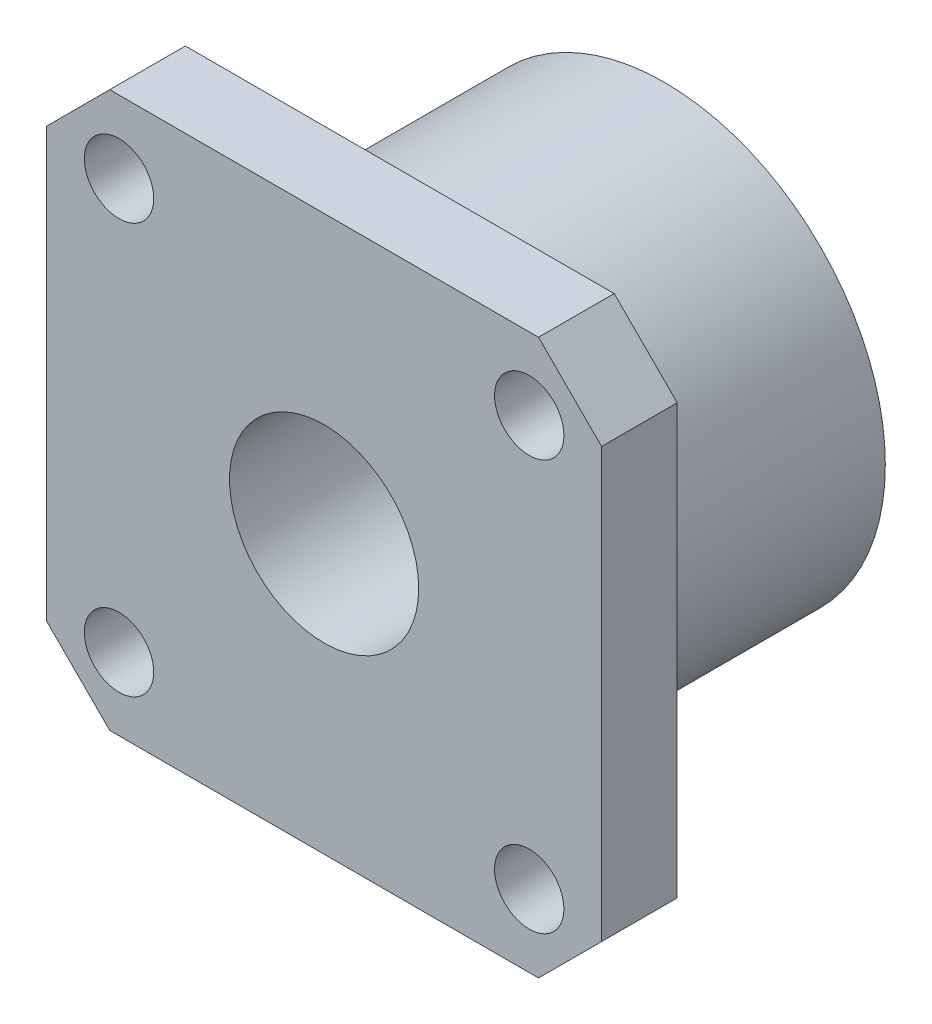
ISO-10303-21;
HEADER;
FILE_DESCRIPTION(('STEP AP214'),'2;1');
FILE_NAME('part.step','',(''),(''),'','','');
FILE_SCHEMA(('AUTOMOTIVE_DESIGN { 1 0 10303 214 1 1 1 1 }'));
ENDSEC;
DATA;
#1=APPLICATION_CONTEXT('core data for automotive mechanical design processes');
#2=APPLICATION_PROTOCOL_DEFINITION('international standard','automotive_design',2000,#1);
#3=PRODUCT_CONTEXT('',#1,'mechanical');
#4=PRODUCT('Part','Part','',(#3));
#5=PRODUCT_RELATED_PRODUCT_CATEGORY('part','',(#4));
#6=PRODUCT_DEFINITION_FORMATION('','',#4);
#7=PRODUCT_DEFINITION_CONTEXT('part definition',#1,'design');
#8=PRODUCT_DEFINITION('design','',#6,#7);
#9=PRODUCT_DEFINITION_SHAPE('','',#8);
#10=(LENGTH_UNIT() NAMED_UNIT(*) SI_UNIT(.MILLI.,.METRE.));
#11=(NAMED_UNIT(*) PLANE_ANGLE_UNIT() SI_UNIT($,.RADIAN.));
#12=(NAMED_UNIT(*) SI_UNIT($,.STERADIAN.) SOLID_ANGLE_UNIT());
#13=UNCERTAINTY_MEASURE_WITH_UNIT(LENGTH_MEASURE(1.E-05),#10,'distance_accuracy_value','');
#14=(GEOMETRIC_REPRESENTATION_CONTEXT(3) GLOBAL_UNCERTAINTY_ASSIGNED_CONTEXT((#13)) GLOBAL_UNIT_ASSIGNED_CONTEXT((#10,
#11,#12)) REPRESENTATION_CONTEXT('',''));
#15=CARTESIAN_POINT('',(0.,0.,0.));
#16=DIRECTION('',(0.,0.,1.));
#17=DIRECTION('',(1.,0.,0.));
#18=AXIS2_PLACEMENT_3D('',#15,#16,#17);
#19=CARTESIAN_POINT('',(0.,0.,6.));
#20=DIRECTION('',(0.,0.,1.));
#21=DIRECTION('',(1.,0.,0.));
#22=AXIS2_PLACEMENT_3D('',#19,#20,#21);
#23=PLANE('',#22);
#24=CARTESIAN_POINT('',(0.,0.,6.));
#25=DIRECTION('',(0.,0.,-1.));
#26=DIRECTION('',(-1.,0.,0.));
#27=AXIS2_PLACEMENT_3D('',#24,#25,#26);
#28=CIRCLE('',#27,7.5);
#29=CARTESIAN_POINT('',(7.5,0.,6.));
#30=VERTEX_POINT('',#29);
#31=EDGE_CURVE('E405',#30,#30,#28,.T.);
#32=ORIENTED_EDGE('',*,*,#31,.T.);
#33=EDGE_LOOP('',(#32));
#34=FACE_BOUND('',#33,.T.);
#35=CARTESIAN_POINT('',(16.2634559672916,-16.2634559672896,6.));
#36=DIRECTION('',(0.,0.,1.));
#37=DIRECTION('',(1.,0.,0.));
#38=AXIS2_PLACEMENT_3D('',#35,#36,#37);
#39=CIRCLE('',#38,2.75);
#40=CARTESIAN_POINT('',(19.0134559672916,-16.2634559672896,6.));
#41=VERTEX_POINT('',#40);
#42=EDGE_CURVE('E232',#41,#41,#39,.T.);
#43=ORIENTED_EDGE('',*,*,#42,.F.);
#44=EDGE_LOOP('',(#43));
#45=FACE_BOUND('',#44,.T.);
#46=CARTESIAN_POINT('',(-16.2634559672906,16.2634559672906,6.));
#47=DIRECTION('',(0.,0.,1.));
#48=DIRECTION('',(1.,0.,0.));
#49=AXIS2_PLACEMENT_3D('',#46,#47,#48);
#50=CIRCLE('',#49,2.75);
#51=CARTESIAN_POINT('',(-13.5134559672906,16.2634559672906,6.));
#52=VERTEX_POINT('',#51);
#53=EDGE_CURVE('E148',#52,#52,#50,.T.);
#54=ORIENTED_EDGE('',*,*,#53,.F.);
#55=EDGE_LOOP('',(#54));
#56=FACE_BOUND('',#55,.T.);
#57=DIRECTION('',(0.,-1.,0.));
#58=VECTOR('',#57,1.);
#59=CARTESIAN_POINT('',(-22.,-22.,6.));
#60=LINE('',#59,#58);
#61=CARTESIAN_POINT('',(-22.,17.,6.));
#62=VERTEX_POINT('',#61);
#63=CARTESIAN_POINT('',(-22.,-17.,6.));
#64=VERTEX_POINT('',#63);
#65=EDGE_CURVE('E154',#62,#64,#60,.T.);
#66=ORIENTED_EDGE('',*,*,#65,.T.);
#67=DIRECTION('',(-0.707106781186546,0.707106781186549,0.));
#68=VECTOR('',#67,1.);
#69=CARTESIAN_POINT('',(-19.5,-19.5,6.));
#70=LINE('',#69,#68);
#71=CARTESIAN_POINT('',(-17.,-22.,6.));
#72=VERTEX_POINT('',#71);
#73=EDGE_CURVE('E178',#64,#72,#70,.F.);
#74=ORIENTED_EDGE('',*,*,#73,.T.);
#75=DIRECTION('',(1.,0.,0.));
#76=VECTOR('',#75,1.);
#77=CARTESIAN_POINT('',(22.,-22.,6.));
#78=LINE('',#77,#76);
#79=CARTESIAN_POINT('',(17.,-22.,6.));
#80=VERTEX_POINT('',#79);
#81=EDGE_CURVE('E131',#72,#80,#78,.T.);
#82=ORIENTED_EDGE('',*,*,#81,.T.);
#83=DIRECTION('',(-0.707106781186549,-0.707106781186546,0.));
#84=VECTOR('',#83,1.);
#85=CARTESIAN_POINT('',(19.5,-19.5,6.));
#86=LINE('',#85,#84);
#87=CARTESIAN_POINT('',(22.,-17.,6.));
#88=VERTEX_POINT('',#87);
#89=EDGE_CURVE('E175',#80,#88,#86,.F.);
#90=ORIENTED_EDGE('',*,*,#89,.T.);
#91=DIRECTION('',(0.,1.,0.));
#92=VECTOR('',#91,1.);
#93=CARTESIAN_POINT('',(22.,-22.,6.));
#94=LINE('',#93,#92);
#95=CARTESIAN_POINT('',(22.,17.,6.));
#96=VERTEX_POINT('',#95);
#97=EDGE_CURVE('E205',#88,#96,#94,.T.);
#98=ORIENTED_EDGE('',*,*,#97,.T.);
#99=DIRECTION('',(0.707106781186547,-0.707106781186549,0.));
#100=VECTOR('',#99,1.);
#101=CARTESIAN_POINT('',(19.5,19.5,6.));
#102=LINE('',#101,#100);
#103=CARTESIAN_POINT('',(17.,22.,6.));
#104=VERTEX_POINT('',#103);
#105=EDGE_CURVE('E65',#96,#104,#102,.F.);
#106=ORIENTED_EDGE('',*,*,#105,.T.);
#107=DIRECTION('',(-1.,0.,0.));
#108=VECTOR('',#107,1.);
#109=CARTESIAN_POINT('',(22.,22.,6.));
#110=LINE('',#109,#108);
#111=CARTESIAN_POINT('',(-17.,22.,6.));
#112=VERTEX_POINT('',#111);
#113=EDGE_CURVE('E156',#104,#112,#110,.T.);
#114=ORIENTED_EDGE('',*,*,#113,.T.);
#115=DIRECTION('',(0.707106781186549,0.707106781186546,0.));
#116=VECTOR('',#115,1.);
#117=CARTESIAN_POINT('',(-19.5,19.5,6.));
#118=LINE('',#117,#116);
#119=EDGE_CURVE('E170',#112,#62,#118,.F.);
#120=ORIENTED_EDGE('',*,*,#119,.T.);
#121=EDGE_LOOP('',(#66,#74,#82,#90,#98,#106,#114,#120));
#122=FACE_BOUND('',#121,.T.);
#123=CARTESIAN_POINT('',(16.2634559672906,16.2634559672916,6.));
#124=DIRECTION('',(0.,0.,1.));
#125=DIRECTION('',(1.,0.,0.));
#126=AXIS2_PLACEMENT_3D('',#123,#124,#125);
#127=CIRCLE('',#126,2.75);
#128=CARTESIAN_POINT('',(19.0134559672906,16.2634559672916,6.));
#129=VERTEX_POINT('',#128);
#130=EDGE_CURVE('E220',#129,#129,#127,.T.);
#131=ORIENTED_EDGE('',*,*,#130,.F.);
#132=EDGE_LOOP('',(#131));
#133=FACE_BOUND('',#132,.T.);
#134=CARTESIAN_POINT('',(-16.2634559672896,-16.2634559672906,6.));
#135=DIRECTION('',(0.,0.,1.));
#136=DIRECTION('',(1.,0.,0.));
#137=AXIS2_PLACEMENT_3D('',#134,#135,#136);
#138=CIRCLE('',#137,2.75);
#139=CARTESIAN_POINT('',(-13.5134559672896,-16.2634559672906,6.));
#140=VERTEX_POINT('',#139);
#141=EDGE_CURVE('E223',#140,#140,#138,.T.);
#142=ORIENTED_EDGE('',*,*,#141,.F.);
#143=EDGE_LOOP('',(#142));
#144=FACE_BOUND('',#143,.T.);
#145=ADVANCED_FACE('F41',(#34,#45,#56,#122,#133,#144),#23,.T.);
#146=CARTESIAN_POINT('',(0.,0.,0.));
#147=DIRECTION('',(0.,0.,1.));
#148=DIRECTION('',(1.,0.,0.));
#149=AXIS2_PLACEMENT_3D('',#146,#147,#148);
#150=PLANE('',#149);
#151=CARTESIAN_POINT('',(0.,0.,0.));
#152=DIRECTION('',(0.,0.,1.));
#153=DIRECTION('',(1.,0.,0.));
#154=AXIS2_PLACEMENT_3D('',#151,#152,#153);
#155=CIRCLE('',#154,17.5);
#156=CARTESIAN_POINT('',(17.5,0.,0.));
#157=VERTEX_POINT('',#156);
#158=EDGE_CURVE('E11',#157,#157,#155,.F.);
#159=ORIENTED_EDGE('',*,*,#158,.F.);
#160=EDGE_LOOP('',(#159));
#161=FACE_BOUND('',#160,.T.);
#162=DIRECTION('',(1.,0.,0.));
#163=VECTOR('',#162,1.);
#164=CARTESIAN_POINT('',(22.,-22.,0.));
#165=LINE('',#164,#163);
#166=CARTESIAN_POINT('',(-17.,-22.,0.));
#167=VERTEX_POINT('',#166);
#168=CARTESIAN_POINT('',(17.,-22.,0.));
#169=VERTEX_POINT('',#168);
#170=EDGE_CURVE('E128',#167,#169,#165,.T.);
#171=ORIENTED_EDGE('',*,*,#170,.F.);
#172=DIRECTION('',(0.707106781186546,-0.707106781186549,0.));
#173=VECTOR('',#172,1.);
#174=CARTESIAN_POINT('',(-17.,-22.,0.));
#175=LINE('',#174,#173);
#176=CARTESIAN_POINT('',(-22.,-17.,0.));
#177=VERTEX_POINT('',#176);
#178=EDGE_CURVE('E110',#167,#177,#175,.F.);
#179=ORIENTED_EDGE('',*,*,#178,.T.);
#180=DIRECTION('',(0.,-1.,0.));
#181=VECTOR('',#180,1.);
#182=CARTESIAN_POINT('',(-22.,-22.,0.));
#183=LINE('',#182,#181);
#184=CARTESIAN_POINT('',(-22.,17.,0.));
#185=VERTEX_POINT('',#184);
#186=EDGE_CURVE('E141',#185,#177,#183,.T.);
#187=ORIENTED_EDGE('',*,*,#186,.F.);
#188=DIRECTION('',(-0.707106781186549,-0.707106781186546,0.));
#189=VECTOR('',#188,1.);
#190=CARTESIAN_POINT('',(-22.,17.,0.));
#191=LINE('',#190,#189);
#192=CARTESIAN_POINT('',(-17.,22.,0.));
#193=VERTEX_POINT('',#192);
#194=EDGE_CURVE('E133',#185,#193,#191,.F.);
#195=ORIENTED_EDGE('',*,*,#194,.T.);
#196=DIRECTION('',(-1.,0.,0.));
#197=VECTOR('',#196,1.);
#198=CARTESIAN_POINT('',(22.,22.,0.));
#199=LINE('',#198,#197);
#200=CARTESIAN_POINT('',(17.,22.,0.));
#201=VERTEX_POINT('',#200);
#202=EDGE_CURVE('E146',#201,#193,#199,.T.);
#203=ORIENTED_EDGE('',*,*,#202,.F.);
#204=DIRECTION('',(-0.707106781186547,0.707106781186549,0.));
#205=VECTOR('',#204,1.);
#206=CARTESIAN_POINT('',(17.,22.,0.));
#207=LINE('',#206,#205);
#208=CARTESIAN_POINT('',(22.,17.,0.));
#209=VERTEX_POINT('',#208);
#210=EDGE_CURVE('E160',#201,#209,#207,.F.);
#211=ORIENTED_EDGE('',*,*,#210,.T.);
#212=DIRECTION('',(0.,1.,0.));
#213=VECTOR('',#212,1.);
#214=CARTESIAN_POINT('',(22.,-22.,0.));
#215=LINE('',#214,#213);
#216=CARTESIAN_POINT('',(22.,-17.,0.));
#217=VERTEX_POINT('',#216);
#218=EDGE_CURVE('E140',#217,#209,#215,.T.);
#219=ORIENTED_EDGE('',*,*,#218,.F.);
#220=DIRECTION('',(0.707106781186549,0.707106781186546,0.));
#221=VECTOR('',#220,1.);
#222=CARTESIAN_POINT('',(22.,-17.,0.));
#223=LINE('',#222,#221);
#224=EDGE_CURVE('E122',#217,#169,#223,.F.);
#225=ORIENTED_EDGE('',*,*,#224,.T.);
#226=EDGE_LOOP('',(#171,#179,#187,#195,#203,#211,#219,#225));
#227=FACE_BOUND('',#226,.T.);
#228=CARTESIAN_POINT('',(-16.2634559672906,16.2634559672906,0.));
#229=DIRECTION('',(0.,0.,1.));
#230=DIRECTION('',(1.,0.,0.));
#231=AXIS2_PLACEMENT_3D('',#228,#229,#230);
#232=CIRCLE('',#231,2.75);
#233=CARTESIAN_POINT('',(-13.5134559672906,16.2634559672906,0.));
#234=VERTEX_POINT('',#233);
#235=EDGE_CURVE('E208',#234,#234,#232,.T.);
#236=ORIENTED_EDGE('',*,*,#235,.T.);
#237=EDGE_LOOP('',(#236));
#238=FACE_BOUND('',#237,.T.);
#239=CARTESIAN_POINT('',(16.2634559672906,16.2634559672916,0.));
#240=DIRECTION('',(0.,0.,1.));
#241=DIRECTION('',(1.,0.,0.));
#242=AXIS2_PLACEMENT_3D('',#239,#240,#241);
#243=CIRCLE('',#242,2.75);
#244=CARTESIAN_POINT('',(19.0134559672906,16.2634559672916,0.));
#245=VERTEX_POINT('',#244);
#246=EDGE_CURVE('E242',#245,#245,#243,.T.);
#247=ORIENTED_EDGE('',*,*,#246,.T.);
#248=EDGE_LOOP('',(#247));
#249=FACE_BOUND('',#248,.T.);
#250=CARTESIAN_POINT('',(16.2634559672916,-16.2634559672896,0.));
#251=DIRECTION('',(0.,0.,1.));
#252=DIRECTION('',(1.,0.,0.));
#253=AXIS2_PLACEMENT_3D('',#250,#251,#252);
#254=CIRCLE('',#253,2.75);
#255=CARTESIAN_POINT('',(19.0134559672916,-16.2634559672896,0.));
#256=VERTEX_POINT('',#255);
#257=EDGE_CURVE('E226',#256,#256,#254,.T.);
#258=ORIENTED_EDGE('',*,*,#257,.T.);
#259=EDGE_LOOP('',(#258));
#260=FACE_BOUND('',#259,.T.);
#261=CARTESIAN_POINT('',(-16.2634559672896,-16.2634559672906,0.));
#262=DIRECTION('',(0.,0.,1.));
#263=DIRECTION('',(1.,0.,0.));
#264=AXIS2_PLACEMENT_3D('',#261,#262,#263);
#265=CIRCLE('',#264,2.75);
#266=CARTESIAN_POINT('',(-13.5134559672896,-16.2634559672906,0.));
#267=VERTEX_POINT('',#266);
#268=EDGE_CURVE('E227',#267,#267,#265,.T.);
#269=ORIENTED_EDGE('',*,*,#268,.T.);
#270=EDGE_LOOP('',(#269));
#271=FACE_BOUND('',#270,.T.);
#272=ADVANCED_FACE('F136',(#161,#227,#238,#249,#260,#271),#150,.F.);
#273=CARTESIAN_POINT('',(-22.,-22.,6.));
#274=DIRECTION('',(1.,0.,0.));
#275=DIRECTION('',(0.,0.,-1.));
#276=AXIS2_PLACEMENT_3D('',#273,#274,#275);
#277=PLANE('',#276);
#278=ORIENTED_EDGE('',*,*,#186,.T.);
#279=DIRECTION('',(0.,0.,1.));
#280=VECTOR('',#279,1.);
#281=CARTESIAN_POINT('',(-22.,-17.,6.));
#282=LINE('',#281,#280);
#283=EDGE_CURVE('E115',#177,#64,#282,.T.);
#284=ORIENTED_EDGE('',*,*,#283,.T.);
#285=ORIENTED_EDGE('',*,*,#65,.F.);
#286=DIRECTION('',(0.,0.,-1.));
#287=VECTOR('',#286,1.);
#288=CARTESIAN_POINT('',(-22.,17.,6.));
#289=LINE('',#288,#287);
#290=EDGE_CURVE('E121',#62,#185,#289,.T.);
#291=ORIENTED_EDGE('',*,*,#290,.T.);
#292=EDGE_LOOP('',(#278,#284,#285,#291));
#293=FACE_BOUND('',#292,.T.);
#294=ADVANCED_FACE('F200',(#293),#277,.F.);
#295=CARTESIAN_POINT('',(22.,-22.,6.));
#296=DIRECTION('',(0.,1.,0.));
#297=DIRECTION('',(-1.,0.,0.));
#298=AXIS2_PLACEMENT_3D('',#295,#296,#297);
#299=PLANE('',#298);
#300=ORIENTED_EDGE('',*,*,#81,.F.);
#301=DIRECTION('',(0.,0.,-1.));
#302=VECTOR('',#301,1.);
#303=CARTESIAN_POINT('',(-17.,-22.,6.));
#304=LINE('',#303,#302);
#305=EDGE_CURVE('E114',#72,#167,#304,.T.);
#306=ORIENTED_EDGE('',*,*,#305,.T.);
#307=ORIENTED_EDGE('',*,*,#170,.T.);
#308=DIRECTION('',(0.,0.,1.));
#309=VECTOR('',#308,1.);
#310=CARTESIAN_POINT('',(17.,-22.,6.));
#311=LINE('',#310,#309);
#312=EDGE_CURVE('E134',#169,#80,#311,.T.);
#313=ORIENTED_EDGE('',*,*,#312,.T.);
#314=EDGE_LOOP('',(#300,#306,#307,#313));
#315=FACE_BOUND('',#314,.T.);
#316=ADVANCED_FACE('F127',(#315),#299,.F.);
#317=CARTESIAN_POINT('',(22.,-22.,6.));
#318=DIRECTION('',(-1.,0.,0.));
#319=DIRECTION('',(0.,0.,1.));
#320=AXIS2_PLACEMENT_3D('',#317,#318,#319);
#321=PLANE('',#320);
#322=ORIENTED_EDGE('',*,*,#97,.F.);
#323=DIRECTION('',(0.,0.,-1.));
#324=VECTOR('',#323,1.);
#325=CARTESIAN_POINT('',(22.,-17.,6.));
#326=LINE('',#325,#324);
#327=EDGE_CURVE('E184',#88,#217,#326,.T.);
#328=ORIENTED_EDGE('',*,*,#327,.T.);
#329=ORIENTED_EDGE('',*,*,#218,.T.);
#330=DIRECTION('',(0.,0.,1.));
#331=VECTOR('',#330,1.);
#332=CARTESIAN_POINT('',(22.,17.,6.));
#333=LINE('',#332,#331);
#334=EDGE_CURVE('E181',#209,#96,#333,.T.);
#335=ORIENTED_EDGE('',*,*,#334,.T.);
#336=EDGE_LOOP('',(#322,#328,#329,#335));
#337=FACE_BOUND('',#336,.T.);
#338=ADVANCED_FACE('F268',(#337),#321,.F.);
#339=CARTESIAN_POINT('',(22.,22.,6.));
#340=DIRECTION('',(0.,-1.,0.));
#341=DIRECTION('',(1.,0.,0.));
#342=AXIS2_PLACEMENT_3D('',#339,#340,#341);
#343=PLANE('',#342);
#344=ORIENTED_EDGE('',*,*,#113,.F.);
#345=DIRECTION('',(0.,0.,-1.));
#346=VECTOR('',#345,1.);
#347=CARTESIAN_POINT('',(17.,22.,6.));
#348=LINE('',#347,#346);
#349=EDGE_CURVE('E51',#104,#201,#348,.T.);
#350=ORIENTED_EDGE('',*,*,#349,.T.);
#351=ORIENTED_EDGE('',*,*,#202,.T.);
#352=DIRECTION('',(0.,0.,1.));
#353=VECTOR('',#352,1.);
#354=CARTESIAN_POINT('',(-17.,22.,6.));
#355=LINE('',#354,#353);
#356=EDGE_CURVE('E58',#193,#112,#355,.T.);
#357=ORIENTED_EDGE('',*,*,#356,.T.);
#358=EDGE_LOOP('',(#344,#350,#351,#357));
#359=FACE_BOUND('',#358,.T.);
#360=ADVANCED_FACE('F193',(#359),#343,.F.);
#361=CARTESIAN_POINT('',(-16.2634559672906,16.2634559672906,6.));
#362=DIRECTION('',(0.,0.,-1.));
#363=DIRECTION('',(-1.,0.,0.));
#364=AXIS2_PLACEMENT_3D('',#361,#362,#363);
#365=CYLINDRICAL_SURFACE('',#364,2.75);
#366=ORIENTED_EDGE('',*,*,#53,.T.);
#367=EDGE_LOOP('',(#366));
#368=FACE_BOUND('',#367,.T.);
#369=ORIENTED_EDGE('',*,*,#235,.F.);
#370=EDGE_LOOP('',(#369));
#371=FACE_BOUND('',#370,.T.);
#372=ADVANCED_FACE('F257',(#368,#371),#365,.F.);
#373=CARTESIAN_POINT('',(16.2634559672906,16.2634559672916,6.));
#374=DIRECTION('',(0.,0.,-1.));
#375=DIRECTION('',(-1.,0.,0.));
#376=AXIS2_PLACEMENT_3D('',#373,#374,#375);
#377=CYLINDRICAL_SURFACE('',#376,2.75);
#378=ORIENTED_EDGE('',*,*,#130,.T.);
#379=EDGE_LOOP('',(#378));
#380=FACE_BOUND('',#379,.T.);
#381=ORIENTED_EDGE('',*,*,#246,.F.);
#382=EDGE_LOOP('',(#381));
#383=FACE_BOUND('',#382,.T.);
#384=ADVANCED_FACE('F259',(#380,#383),#377,.F.);
#385=CARTESIAN_POINT('',(16.2634559672916,-16.2634559672896,6.));
#386=DIRECTION('',(0.,0.,-1.));
#387=DIRECTION('',(-1.,0.,0.));
#388=AXIS2_PLACEMENT_3D('',#385,#386,#387);
#389=CYLINDRICAL_SURFACE('',#388,2.75);
#390=ORIENTED_EDGE('',*,*,#42,.T.);
#391=EDGE_LOOP('',(#390));
#392=FACE_BOUND('',#391,.T.);
#393=ORIENTED_EDGE('',*,*,#257,.F.);
#394=EDGE_LOOP('',(#393));
#395=FACE_BOUND('',#394,.T.);
#396=ADVANCED_FACE('F265',(#392,#395),#389,.F.);
#397=CARTESIAN_POINT('',(-16.2634559672896,-16.2634559672906,6.));
#398=DIRECTION('',(0.,0.,-1.));
#399=DIRECTION('',(-1.,0.,0.));
#400=AXIS2_PLACEMENT_3D('',#397,#398,#399);
#401=CYLINDRICAL_SURFACE('',#400,2.75);
#402=ORIENTED_EDGE('',*,*,#141,.T.);
#403=EDGE_LOOP('',(#402));
#404=FACE_BOUND('',#403,.T.);
#405=ORIENTED_EDGE('',*,*,#268,.F.);
#406=EDGE_LOOP('',(#405));
#407=FACE_BOUND('',#406,.T.);
#408=ADVANCED_FACE('F289',(#404,#407),#401,.F.);
#409=CARTESIAN_POINT('',(-17.,-22.,6.));
#410=DIRECTION('',(0.707106781186549,0.707106781186546,0.));
#411=DIRECTION('',(0.,0.,-1.));
#412=AXIS2_PLACEMENT_3D('',#409,#410,#411);
#413=PLANE('',#412);
#414=ORIENTED_EDGE('',*,*,#73,.F.);
#415=ORIENTED_EDGE('',*,*,#283,.F.);
#416=ORIENTED_EDGE('',*,*,#178,.F.);
#417=ORIENTED_EDGE('',*,*,#305,.F.);
#418=EDGE_LOOP('',(#414,#415,#416,#417));
#419=FACE_BOUND('',#418,.T.);
#420=ADVANCED_FACE('F113',(#419),#413,.F.);
#421=CARTESIAN_POINT('',(22.,-17.,6.));
#422=DIRECTION('',(-0.707106781186546,0.707106781186549,0.));
#423=DIRECTION('',(0.,0.,-1.));
#424=AXIS2_PLACEMENT_3D('',#421,#422,#423);
#425=PLANE('',#424);
#426=ORIENTED_EDGE('',*,*,#89,.F.);
#427=ORIENTED_EDGE('',*,*,#312,.F.);
#428=ORIENTED_EDGE('',*,*,#224,.F.);
#429=ORIENTED_EDGE('',*,*,#327,.F.);
#430=EDGE_LOOP('',(#426,#427,#428,#429));
#431=FACE_BOUND('',#430,.T.);
#432=ADVANCED_FACE('F288',(#431),#425,.F.);
#433=CARTESIAN_POINT('',(17.,22.,6.));
#434=DIRECTION('',(-0.707106781186549,-0.707106781186547,0.));
#435=DIRECTION('',(0.,0.,-1.));
#436=AXIS2_PLACEMENT_3D('',#433,#434,#435);
#437=PLANE('',#436);
#438=ORIENTED_EDGE('',*,*,#105,.F.);
#439=ORIENTED_EDGE('',*,*,#334,.F.);
#440=ORIENTED_EDGE('',*,*,#210,.F.);
#441=ORIENTED_EDGE('',*,*,#349,.F.);
#442=EDGE_LOOP('',(#438,#439,#440,#441));
#443=FACE_BOUND('',#442,.T.);
#444=ADVANCED_FACE('F294',(#443),#437,.F.);
#445=CARTESIAN_POINT('',(-22.,17.,6.));
#446=DIRECTION('',(0.707106781186546,-0.707106781186549,0.));
#447=DIRECTION('',(0.,0.,-1.));
#448=AXIS2_PLACEMENT_3D('',#445,#446,#447);
#449=PLANE('',#448);
#450=ORIENTED_EDGE('',*,*,#119,.F.);
#451=ORIENTED_EDGE('',*,*,#356,.F.);
#452=ORIENTED_EDGE('',*,*,#194,.F.);
#453=ORIENTED_EDGE('',*,*,#290,.F.);
#454=EDGE_LOOP('',(#450,#451,#452,#453));
#455=FACE_BOUND('',#454,.T.);
#456=ADVANCED_FACE('F44',(#455),#449,.F.);
#457=CARTESIAN_POINT('',(0.,0.,-21.));
#458=DIRECTION('',(0.,0.,-1.));
#459=DIRECTION('',(-1.,0.,0.));
#460=AXIS2_PLACEMENT_3D('',#457,#458,#459);
#461=PLANE('',#460);
#462=CARTESIAN_POINT('',(0.,0.,-21.));
#463=DIRECTION('',(0.,0.,-1.));
#464=DIRECTION('',(-1.,0.,0.));
#465=AXIS2_PLACEMENT_3D('',#462,#463,#464);
#466=CIRCLE('',#465,17.5);
#467=CARTESIAN_POINT('',(17.5,0.,-21.));
#468=VERTEX_POINT('',#467);
#469=EDGE_CURVE('E235',#468,#468,#466,.T.);
#470=ORIENTED_EDGE('',*,*,#469,.T.);
#471=EDGE_LOOP('',(#470));
#472=FACE_BOUND('',#471,.T.);
#473=CARTESIAN_POINT('',(0.,0.,-21.));
#474=DIRECTION('',(0.,0.,-1.));
#475=DIRECTION('',(-1.,0.,0.));
#476=AXIS2_PLACEMENT_3D('',#473,#474,#475);
#477=CIRCLE('',#476,7.5);
#478=CARTESIAN_POINT('',(7.5,0.,-21.));
#479=VERTEX_POINT('',#478);
#480=EDGE_CURVE('E402',#479,#479,#477,.T.);
#481=ORIENTED_EDGE('',*,*,#480,.F.);
#482=EDGE_LOOP('',(#481));
#483=FACE_BOUND('',#482,.T.);
#484=ADVANCED_FACE('F302',(#472,#483),#461,.T.);
#485=CARTESIAN_POINT('',(0.,0.,-21.));
#486=DIRECTION('',(0.,0.,1.));
#487=DIRECTION('',(1.,0.,0.));
#488=AXIS2_PLACEMENT_3D('',#485,#486,#487);
#489=CYLINDRICAL_SURFACE('',#488,17.5);
#490=CARTESIAN_POINT('',(17.5,0.,-21.));
#491=CARTESIAN_POINT('',(17.5,0.,-20.78125));
#492=CARTESIAN_POINT('',(17.5,0.,-20.5625));
#493=CARTESIAN_POINT('',(17.5,0.,-20.125));
#494=CARTESIAN_POINT('',(17.5,0.,-19.90625));
#495=CARTESIAN_POINT('',(17.5,0.,-19.46875));
#496=CARTESIAN_POINT('',(17.5,0.,-19.25));
#497=CARTESIAN_POINT('',(17.5,0.,-18.8125));
#498=CARTESIAN_POINT('',(17.5,0.,-18.59375));
#499=CARTESIAN_POINT('',(17.5,0.,-18.15625));
#500=CARTESIAN_POINT('',(17.5,0.,-17.9375));
#501=CARTESIAN_POINT('',(17.5,0.,-17.5));
#502=CARTESIAN_POINT('',(17.5,0.,-17.28125));
#503=CARTESIAN_POINT('',(17.5,0.,-16.84375));
#504=CARTESIAN_POINT('',(17.5,0.,-16.625));
#505=CARTESIAN_POINT('',(17.5,0.,-16.1875));
#506=CARTESIAN_POINT('',(17.5,0.,-15.96875));
#507=CARTESIAN_POINT('',(17.5,0.,-15.53125));
#508=CARTESIAN_POINT('',(17.5,0.,-15.3125));
#509=CARTESIAN_POINT('',(17.5,0.,-14.875));
#510=CARTESIAN_POINT('',(17.5,0.,-14.65625));
#511=CARTESIAN_POINT('',(17.5,0.,-14.21875));
#512=CARTESIAN_POINT('',(17.5,0.,-14.));
#513=CARTESIAN_POINT('',(17.5,0.,-13.5625));
#514=CARTESIAN_POINT('',(17.5,0.,-13.34375));
#515=CARTESIAN_POINT('',(17.5,0.,-12.90625));
#516=CARTESIAN_POINT('',(17.5,0.,-12.6875));
#517=CARTESIAN_POINT('',(17.5,0.,-12.25));
#518=CARTESIAN_POINT('',(17.5,0.,-12.03125));
#519=CARTESIAN_POINT('',(17.5,0.,-11.59375));
#520=CARTESIAN_POINT('',(17.5,0.,-11.375));
#521=CARTESIAN_POINT('',(17.5,0.,-10.9375));
#522=CARTESIAN_POINT('',(17.5,0.,-10.71875));
#523=CARTESIAN_POINT('',(17.5,0.,-10.28125));
#524=CARTESIAN_POINT('',(17.5,0.,-10.0625));
#525=CARTESIAN_POINT('',(17.5,0.,-9.625));
#526=CARTESIAN_POINT('',(17.5,0.,-9.40625));
#527=CARTESIAN_POINT('',(17.5,0.,-8.96875));
#528=CARTESIAN_POINT('',(17.5,0.,-8.75));
#529=CARTESIAN_POINT('',(17.5,0.,-8.3125));
#530=CARTESIAN_POINT('',(17.5,0.,-8.09375));
#531=CARTESIAN_POINT('',(17.5,0.,-7.65625));
#532=CARTESIAN_POINT('',(17.5,0.,-7.4375));
#533=CARTESIAN_POINT('',(17.5,0.,-7.));
#534=CARTESIAN_POINT('',(17.5,0.,-6.78125));
#535=CARTESIAN_POINT('',(17.5,0.,-6.34375));
#536=CARTESIAN_POINT('',(17.5,0.,-6.125));
#537=CARTESIAN_POINT('',(17.5,0.,-5.6875));
#538=CARTESIAN_POINT('',(17.5,0.,-5.46875));
#539=CARTESIAN_POINT('',(17.5,0.,-5.03125));
#540=CARTESIAN_POINT('',(17.5,0.,-4.8125));
#541=CARTESIAN_POINT('',(17.5,0.,-4.375));
#542=CARTESIAN_POINT('',(17.5,0.,-4.15625));
#543=CARTESIAN_POINT('',(17.5,0.,-3.71875));
#544=CARTESIAN_POINT('',(17.5,0.,-3.5));
#545=CARTESIAN_POINT('',(17.5,0.,-3.0625));
#546=CARTESIAN_POINT('',(17.5,0.,-2.84375));
#547=CARTESIAN_POINT('',(17.5,0.,-2.40625));
#548=CARTESIAN_POINT('',(17.5,0.,-2.1875));
#549=CARTESIAN_POINT('',(17.5,0.,-1.75));
#550=CARTESIAN_POINT('',(17.5,0.,-1.53125));
#551=CARTESIAN_POINT('',(17.5,0.,-1.09375));
#552=CARTESIAN_POINT('',(17.5,0.,-0.875000000000001));
#553=CARTESIAN_POINT('',(17.5,0.,-0.4375));
#554=CARTESIAN_POINT('',(17.5,0.,-0.21875));
#555=CARTESIAN_POINT('',(17.5,0.,0.));
#556=B_SPLINE_CURVE_WITH_KNOTS('',3,(#490,#491,#492,#493,#494,#495,#496,#497,#498,#499,#500,
#501,#502,#503,#504,#505,#506,#507,#508,#509,#510,#511,#512,#513,#514,#515,#516,#517,#518,#519,
#520,#521,#522,#523,#524,#525,#526,#527,#528,#529,#530,#531,#532,#533,#534,#535,#536,#537,#538,
#539,#540,#541,#542,#543,#544,#545,#546,#547,#548,#549,#550,#551,#552,#553,#554,#555),
.UNSPECIFIED.,.F.,.F.,(4,2,2,2,2,2,2,2,2,2,2,2,2,2,2,2,2,2,2,2,2,2,2,2,2,2,2,2,2,2,2,2,4),(0.,
0.656249999999997,1.3125,1.96875,2.625,3.28125,3.9375,4.59375,5.25,5.90625,6.5625,7.21875,7.875,
8.53125,9.1875,9.84375,10.5,11.15625,11.8125,12.46875,13.125,13.78125,14.4375,15.09375,15.75,
16.40625,17.0625,17.71875,18.375,19.03125,19.6875,20.34375,21.),.UNSPECIFIED.);
#557=EDGE_CURVE('BSEAM310',#468,#157,#556,.T.);
#558=ORIENTED_EDGE('',*,*,#469,.F.);
#559=ORIENTED_EDGE('',*,*,#158,.T.);
#560=ORIENTED_EDGE('',*,*,#557,.T.);
#561=ORIENTED_EDGE('',*,*,#557,.F.);
#562=EDGE_LOOP('',(#558,#560,#559,#561));
#563=FACE_BOUND('',#562,.T.);
#564=ADVANCED_FACE('F310',(#563),#489,.T.);
#565=CARTESIAN_POINT('',(0.,0.,-21.));
#566=DIRECTION('',(0.,0.,1.));
#567=DIRECTION('',(1.,0.,0.));
#568=AXIS2_PLACEMENT_3D('',#565,#566,#567);
#569=CYLINDRICAL_SURFACE('',#568,7.5);
#570=CARTESIAN_POINT('',(7.5,0.,-21.));
#571=CARTESIAN_POINT('',(7.5,0.,-20.71875));
#572=CARTESIAN_POINT('',(7.5,0.,-20.4375));
#573=CARTESIAN_POINT('',(7.5,0.,-19.875));
#574=CARTESIAN_POINT('',(7.5,0.,-19.59375));
#575=CARTESIAN_POINT('',(7.5,0.,-19.03125));
#576=CARTESIAN_POINT('',(7.5,0.,-18.75));
#577=CARTESIAN_POINT('',(7.5,0.,-18.1875));
#578=CARTESIAN_POINT('',(7.5,0.,-17.90625));
#579=CARTESIAN_POINT('',(7.5,0.,-17.34375));
#580=CARTESIAN_POINT('',(7.5,0.,-17.0625));
#581=CARTESIAN_POINT('',(7.5,0.,-16.5));
#582=CARTESIAN_POINT('',(7.5,0.,-16.21875));
#583=CARTESIAN_POINT('',(7.5,0.,-15.65625));
#584=CARTESIAN_POINT('',(7.5,0.,-15.375));
#585=CARTESIAN_POINT('',(7.5,0.,-14.8125));
#586=CARTESIAN_POINT('',(7.5,0.,-14.53125));
#587=CARTESIAN_POINT('',(7.5,0.,-13.96875));
#588=CARTESIAN_POINT('',(7.5,0.,-13.6875));
#589=CARTESIAN_POINT('',(7.5,0.,-13.125));
#590=CARTESIAN_POINT('',(7.5,0.,-12.84375));
#591=CARTESIAN_POINT('',(7.5,0.,-12.28125));
#592=CARTESIAN_POINT('',(7.5,0.,-12.));
#593=CARTESIAN_POINT('',(7.5,0.,-11.4375));
#594=CARTESIAN_POINT('',(7.5,0.,-11.15625));
#595=CARTESIAN_POINT('',(7.5,0.,-10.59375));
#596=CARTESIAN_POINT('',(7.5,0.,-10.3125));
#597=CARTESIAN_POINT('',(7.5,0.,-9.75));
#598=CARTESIAN_POINT('',(7.5,0.,-9.46875));
#599=CARTESIAN_POINT('',(7.5,0.,-8.90625));
#600=CARTESIAN_POINT('',(7.5,0.,-8.625));
#601=CARTESIAN_POINT('',(7.5,0.,-8.0625));
#602=CARTESIAN_POINT('',(7.5,0.,-7.78125));
#603=CARTESIAN_POINT('',(7.5,0.,-7.21875));
#604=CARTESIAN_POINT('',(7.5,0.,-6.9375));
#605=CARTESIAN_POINT('',(7.5,0.,-6.375));
#606=CARTESIAN_POINT('',(7.5,0.,-6.09375));
#607=CARTESIAN_POINT('',(7.5,0.,-5.53125));
#608=CARTESIAN_POINT('',(7.5,0.,-5.25));
#609=CARTESIAN_POINT('',(7.5,0.,-4.6875));
#610=CARTESIAN_POINT('',(7.5,0.,-4.40625));
#611=CARTESIAN_POINT('',(7.5,0.,-3.84375));
#612=CARTESIAN_POINT('',(7.5,0.,-3.5625));
#613=CARTESIAN_POINT('',(7.5,0.,-3.));
#614=CARTESIAN_POINT('',(7.5,0.,-2.71875));
#615=CARTESIAN_POINT('',(7.5,0.,-2.15625));
#616=CARTESIAN_POINT('',(7.5,0.,-1.875));
#617=CARTESIAN_POINT('',(7.5,0.,-1.3125));
#618=CARTESIAN_POINT('',(7.5,0.,-1.03125));
#619=CARTESIAN_POINT('',(7.5,0.,-0.468750000000002));
#620=CARTESIAN_POINT('',(7.5,0.,-0.187500000000002));
#621=CARTESIAN_POINT('',(7.5,0.,0.374999999999997));
#622=CARTESIAN_POINT('',(7.5,0.,0.656249999999997));
#623=CARTESIAN_POINT('',(7.5,0.,1.21875));
#624=CARTESIAN_POINT('',(7.5,0.,1.5));
#625=CARTESIAN_POINT('',(7.5,0.,2.0625));
#626=CARTESIAN_POINT('',(7.5,0.,2.34375));
#627=CARTESIAN_POINT('',(7.5,0.,2.90625));
#628=CARTESIAN_POINT('',(7.5,0.,3.1875));
#629=CARTESIAN_POINT('',(7.5,0.,3.75));
#630=CARTESIAN_POINT('',(7.5,0.,4.03125));
#631=CARTESIAN_POINT('',(7.5,0.,4.59375));
#632=CARTESIAN_POINT('',(7.5,0.,4.875));
#633=CARTESIAN_POINT('',(7.5,0.,5.4375));
#634=CARTESIAN_POINT('',(7.5,0.,5.71875));
#635=CARTESIAN_POINT('',(7.5,0.,6.));
#636=B_SPLINE_CURVE_WITH_KNOTS('',3,(#570,#571,#572,#573,#574,#575,#576,#577,#578,#579,#580,
#581,#582,#583,#584,#585,#586,#587,#588,#589,#590,#591,#592,#593,#594,#595,#596,#597,#598,#599,
#600,#601,#602,#603,#604,#605,#606,#607,#608,#609,#610,#611,#612,#613,#614,#615,#616,#617,#618,
#619,#620,#621,#622,#623,#624,#625,#626,#627,#628,#629,#630,#631,#632,#633,#634,#635),
.UNSPECIFIED.,.F.,.F.,(4,2,2,2,2,2,2,2,2,2,2,2,2,2,2,2,2,2,2,2,2,2,2,2,2,2,2,2,2,2,2,2,4),(0.,
0.843750000000001,1.6875,2.53125,3.375,4.21875,5.0625,5.90625,6.75,7.59375,8.4375,9.28125,
10.125,10.96875,11.8125,12.65625,13.5,14.34375,15.1875,16.03125,16.875,17.71875,18.5625,
19.40625,20.25,21.09375,21.9375,22.78125,23.625,24.46875,25.3125,26.15625,27.),.UNSPECIFIED.);
#637=EDGE_CURVE('BSEAM316',#479,#30,#636,.T.);
#638=ORIENTED_EDGE('',*,*,#480,.T.);
#639=ORIENTED_EDGE('',*,*,#31,.F.);
#640=ORIENTED_EDGE('',*,*,#637,.T.);
#641=ORIENTED_EDGE('',*,*,#637,.F.);
#642=EDGE_LOOP('',(#638,#640,#639,#641));
#643=FACE_BOUND('',#642,.T.);
#644=ADVANCED_FACE('F316',(#643),#569,.F.);
#645=CLOSED_SHELL('',(#145,#272,#294,#316,#338,#360,#372,#384,#396,#408,#420,#432,#444,#456,
#484,#564,#644));
#646=MANIFOLD_SOLID_BREP('B2',#645);
#647=ADVANCED_BREP_SHAPE_REPRESENTATION('',(#18,#646),#14);
#648=SHAPE_DEFINITION_REPRESENTATION(#9,#647);
ENDSEC;
END-ISO-10303-21;
